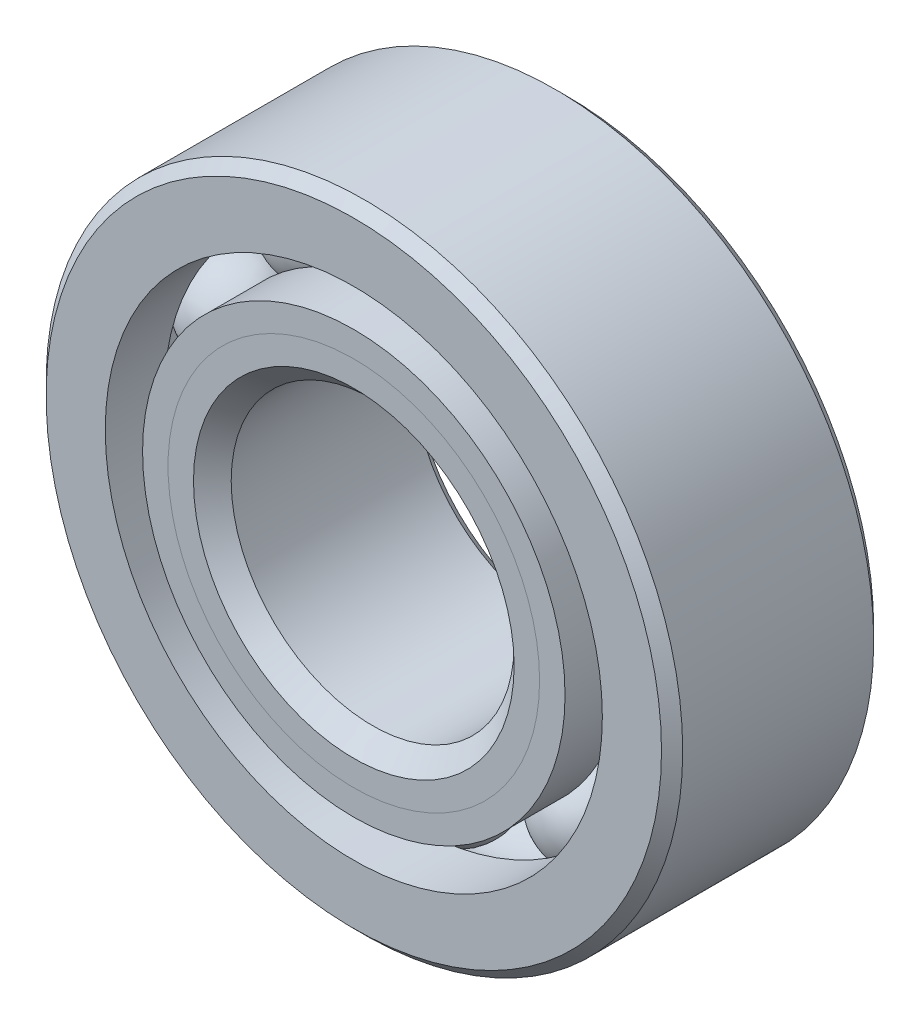
ISO-10303-21;
HEADER;
FILE_DESCRIPTION(('STEP AP214'),'2;1');
FILE_NAME('part.step','',(''),(''),'','','');
FILE_SCHEMA(('AUTOMOTIVE_DESIGN { 1 0 10303 214 1 1 1 1 }'));
ENDSEC;
DATA;
#1=APPLICATION_CONTEXT('core data for automotive mechanical design processes');
#2=APPLICATION_PROTOCOL_DEFINITION('international standard','automotive_design',2000,#1);
#3=PRODUCT_CONTEXT('',#1,'mechanical');
#4=PRODUCT('Part','Part','',(#3));
#5=PRODUCT_RELATED_PRODUCT_CATEGORY('part','',(#4));
#6=PRODUCT_DEFINITION_FORMATION('','',#4);
#7=PRODUCT_DEFINITION_CONTEXT('part definition',#1,'design');
#8=PRODUCT_DEFINITION('design','',#6,#7);
#9=PRODUCT_DEFINITION_SHAPE('','',#8);
#10=(LENGTH_UNIT() NAMED_UNIT(*) SI_UNIT(.MILLI.,.METRE.));
#11=(NAMED_UNIT(*) PLANE_ANGLE_UNIT() SI_UNIT($,.RADIAN.));
#12=(NAMED_UNIT(*) SI_UNIT($,.STERADIAN.) SOLID_ANGLE_UNIT());
#13=UNCERTAINTY_MEASURE_WITH_UNIT(LENGTH_MEASURE(1.E-05),#10,'distance_accuracy_value','');
#14=(GEOMETRIC_REPRESENTATION_CONTEXT(3) GLOBAL_UNCERTAINTY_ASSIGNED_CONTEXT((#13)) GLOBAL_UNIT_ASSIGNED_CONTEXT((#10,
#11,#12)) REPRESENTATION_CONTEXT('',''));
#15=CARTESIAN_POINT('',(0.,0.,0.));
#16=DIRECTION('',(0.,0.,1.));
#17=DIRECTION('',(1.,0.,0.));
#18=AXIS2_PLACEMENT_3D('',#15,#16,#17);
#19=CARTESIAN_POINT('',(-6.06520907209285,8.34804411070657,0.));
#20=DIRECTION('',(0.,0.,1.));
#21=DIRECTION('',(-0.587785252292462,0.809016994374955,0.));
#22=AXIS2_PLACEMENT_3D('',#19,#20,#21);
#23=SPHERICAL_SURFACE('',#22,2.27628073054021);
#24=CARTESIAN_POINT('',(-6.06520907209285,8.34804411070657,2.27628073054021));
#25=VERTEX_POINT('',#24);
#26=VERTEX_LOOP('',#25);
#27=FACE_BOUND('',#26,.T.);
#28=ADVANCED_FACE('F42',(#27),#23,.T.);
#29=CLOSED_SHELL('',(#28));
#30=MANIFOLD_SOLID_BREP('B2',#29);
#31=CARTESIAN_POINT('',(-9.81371442752058,3.1886691107066,0.));
#32=DIRECTION('',(0.,0.,1.));
#33=DIRECTION('',(-0.95105651629515,0.309016994374958,0.));
#34=AXIS2_PLACEMENT_3D('',#31,#32,#33);
#35=SPHERICAL_SURFACE('',#34,2.27628073054021);
#36=CARTESIAN_POINT('',(-9.81371442752058,3.1886691107066,2.27628073054021));
#37=VERTEX_POINT('',#36);
#38=VERTEX_LOOP('',#37);
#39=FACE_BOUND('',#38,.T.);
#40=ADVANCED_FACE('F77',(#39),#35,.T.);
#41=CLOSED_SHELL('',(#40));
#42=MANIFOLD_SOLID_BREP('B6',#41);
#43=CARTESIAN_POINT('',(-9.81371442752065,-3.18866911070639,0.));
#44=DIRECTION('',(0.,0.,1.));
#45=DIRECTION('',(-0.951056516295157,-0.309016994374938,0.));
#46=AXIS2_PLACEMENT_3D('',#43,#44,#45);
#47=SPHERICAL_SURFACE('',#46,2.27628073054021);
#48=CARTESIAN_POINT('',(-9.81371442752065,-3.18866911070639,2.27628073054021));
#49=VERTEX_POINT('',#48);
#50=VERTEX_LOOP('',#49);
#51=FACE_BOUND('',#50,.T.);
#52=ADVANCED_FACE('F112',(#51),#47,.T.);
#53=CLOSED_SHELL('',(#52));
#54=MANIFOLD_SOLID_BREP('B38',#53);
#55=CARTESIAN_POINT('',(-6.06520907209303,-8.34804411070643,0.));
#56=DIRECTION('',(0.,0.,1.));
#57=DIRECTION('',(-0.58778525229248,-0.809016994374942,0.));
#58=AXIS2_PLACEMENT_3D('',#55,#56,#57);
#59=SPHERICAL_SURFACE('',#58,2.27628073054021);
#60=CARTESIAN_POINT('',(-6.06520907209303,-8.34804411070643,2.27628073054021));
#61=VERTEX_POINT('',#60);
#62=VERTEX_LOOP('',#61);
#63=FACE_BOUND('',#62,.T.);
#64=ADVANCED_FACE('F145',(#63),#59,.T.);
#65=CLOSED_SHELL('',(#64));
#66=MANIFOLD_SOLID_BREP('B73',#65);
#67=CARTESIAN_POINT('',(0.,-10.31875,0.));
#68=DIRECTION('',(0.,0.,1.));
#69=DIRECTION('',(0.,-1.,0.));
#70=AXIS2_PLACEMENT_3D('',#67,#68,#69);
#71=SPHERICAL_SURFACE('',#70,2.27628073054021);
#72=CARTESIAN_POINT('',(0.,-10.31875,2.27628073054021));
#73=VERTEX_POINT('',#72);
#74=VERTEX_LOOP('',#73);
#75=FACE_BOUND('',#74,.T.);
#76=ADVANCED_FACE('F180',(#75),#71,.T.);
#77=CLOSED_SHELL('',(#76));
#78=MANIFOLD_SOLID_BREP('B108',#77);
#79=CARTESIAN_POINT('',(6.06520907209291,-8.34804411070652,0.));
#80=DIRECTION('',(0.,0.,1.));
#81=DIRECTION('',(0.587785252292469,-0.809016994374951,0.));
#82=AXIS2_PLACEMENT_3D('',#79,#80,#81);
#83=SPHERICAL_SURFACE('',#82,2.27628073054021);
#84=CARTESIAN_POINT('',(6.06520907209291,-8.34804411070652,2.27628073054021));
#85=VERTEX_POINT('',#84);
#86=VERTEX_LOOP('',#85);
#87=FACE_BOUND('',#86,.T.);
#88=ADVANCED_FACE('F215',(#87),#83,.T.);
#89=CLOSED_SHELL('',(#88));
#90=MANIFOLD_SOLID_BREP('B141',#89);
#91=CARTESIAN_POINT('',(9.8137144275206,-3.18866911070653,0.));
#92=DIRECTION('',(0.,0.,1.));
#93=DIRECTION('',(0.951056516295152,-0.309016994374952,0.));
#94=AXIS2_PLACEMENT_3D('',#91,#92,#93);
#95=SPHERICAL_SURFACE('',#94,2.27628073054021);
#96=CARTESIAN_POINT('',(9.8137144275206,-3.18866911070653,2.27628073054021));
#97=VERTEX_POINT('',#96);
#98=VERTEX_LOOP('',#97);
#99=FACE_BOUND('',#98,.T.);
#100=ADVANCED_FACE('F250',(#99),#95,.T.);
#101=CLOSED_SHELL('',(#100));
#102=MANIFOLD_SOLID_BREP('B176',#101);
#103=CARTESIAN_POINT('',(9.81371442752063,3.18866911070646,0.));
#104=DIRECTION('',(0.,0.,1.));
#105=DIRECTION('',(0.951056516295155,0.309016994374945,0.));
#106=AXIS2_PLACEMENT_3D('',#103,#104,#105);
#107=SPHERICAL_SURFACE('',#106,2.27628073054021);
#108=CARTESIAN_POINT('',(9.81371442752063,3.18866911070646,2.27628073054021));
#109=VERTEX_POINT('',#108);
#110=VERTEX_LOOP('',#109);
#111=FACE_BOUND('',#110,.T.);
#112=ADVANCED_FACE('F285',(#111),#107,.T.);
#113=CLOSED_SHELL('',(#112));
#114=MANIFOLD_SOLID_BREP('B211',#113);
#115=CARTESIAN_POINT('',(6.06520907209297,8.34804411070648,0.));
#116=DIRECTION('',(0.,0.,1.));
#117=DIRECTION('',(0.587785252292474,0.809016994374947,0.));
#118=AXIS2_PLACEMENT_3D('',#115,#116,#117);
#119=SPHERICAL_SURFACE('',#118,2.27628073054021);
#120=CARTESIAN_POINT('',(6.06520907209297,8.34804411070648,2.27628073054021));
#121=VERTEX_POINT('',#120);
#122=VERTEX_LOOP('',#121);
#123=FACE_BOUND('',#122,.T.);
#124=ADVANCED_FACE('F320',(#123),#119,.T.);
#125=CLOSED_SHELL('',(#124));
#126=MANIFOLD_SOLID_BREP('B246',#125);
#127=CARTESIAN_POINT('',(0.,10.31875,0.));
#128=DIRECTION('',(0.,0.,1.));
#129=DIRECTION('',(0.,1.,0.));
#130=AXIS2_PLACEMENT_3D('',#127,#128,#129);
#131=SPHERICAL_SURFACE('',#130,2.27628073054021);
#132=CARTESIAN_POINT('',(0.,10.31875,2.27628073054021));
#133=VERTEX_POINT('',#132);
#134=VERTEX_LOOP('',#133);
#135=FACE_BOUND('',#134,.T.);
#136=ADVANCED_FACE('F357',(#135),#131,.T.);
#137=CLOSED_SHELL('',(#136));
#138=MANIFOLD_SOLID_BREP('B281',#137);
#139=CARTESIAN_POINT('',(0.,8.33881099868363,4.7625));
#140=DIRECTION('',(0.,0.,-1.));
#141=DIRECTION('',(-1.,0.,0.));
#142=AXIS2_PLACEMENT_3D('',#139,#140,#141);
#143=PLANE('',#142);
#144=CARTESIAN_POINT('',(0.,0.,4.7625));
#145=DIRECTION('',(0.,0.,1.));
#146=DIRECTION('',(1.,0.,0.));
#147=AXIS2_PLACEMENT_3D('',#144,#145,#146);
#148=CIRCLE('',#147,7.19623463472989);
#149=CARTESIAN_POINT('',(7.19623463472989,0.,4.7625));
#150=VERTEX_POINT('',#149);
#151=EDGE_CURVE('E414',#150,#150,#148,.T.);
#152=ORIENTED_EDGE('',*,*,#151,.F.);
#153=EDGE_LOOP('',(#152));
#154=FACE_BOUND('',#153,.T.);
#155=CARTESIAN_POINT('',(0.,0.,4.7625));
#156=DIRECTION('',(0.,0.,1.));
#157=DIRECTION('',(1.,0.,0.));
#158=AXIS2_PLACEMENT_3D('',#155,#156,#157);
#159=CIRCLE('',#158,8.33881099868363);
#160=CARTESIAN_POINT('',(8.33881099868363,0.,4.7625));
#161=VERTEX_POINT('',#160);
#162=EDGE_CURVE('E356',#161,#161,#159,.T.);
#163=ORIENTED_EDGE('',*,*,#162,.T.);
#164=EDGE_LOOP('',(#163));
#165=FACE_BOUND('',#164,.T.);
#166=ADVANCED_FACE('F380',(#154,#165),#143,.F.);
#167=CARTESIAN_POINT('',(0.,0.,3.61992363604627));
#168=DIRECTION('',(0.,0.,1.));
#169=DIRECTION('',(1.,0.,0.));
#170=AXIS2_PLACEMENT_3D('',#167,#168,#169);
#171=CONICAL_SURFACE('',#170,7.19623463472989,0.78539816339745);
#172=ORIENTED_EDGE('',*,*,#162,.F.);
#173=EDGE_LOOP('',(#172));
#174=FACE_BOUND('',#173,.T.);
#175=CARTESIAN_POINT('',(0.,0.,3.61992363604627));
#176=DIRECTION('',(0.,0.,1.));
#177=DIRECTION('',(1.,0.,0.));
#178=AXIS2_PLACEMENT_3D('',#175,#176,#177);
#179=CIRCLE('',#178,7.19623463472989);
#180=CARTESIAN_POINT('',(7.19623463472989,0.,3.61992363604627));
#181=VERTEX_POINT('',#180);
#182=EDGE_CURVE('E386',#181,#181,#179,.T.);
#183=ORIENTED_EDGE('',*,*,#182,.T.);
#184=EDGE_LOOP('',(#183));
#185=FACE_BOUND('',#184,.T.);
#186=ADVANCED_FACE('F421',(#174,#185),#171,.T.);
#187=CARTESIAN_POINT('',(0.,0.,4.7625));
#188=DIRECTION('',(0.,0.,1.));
#189=DIRECTION('',(1.,0.,0.));
#190=AXIS2_PLACEMENT_3D('',#187,#188,#189);
#191=CYLINDRICAL_SURFACE('',#190,7.19623463472989);
#192=ORIENTED_EDGE('',*,*,#182,.F.);
#193=EDGE_LOOP('',(#192));
#194=FACE_BOUND('',#193,.T.);
#195=CARTESIAN_POINT('',(0.,0.,0.));
#196=DIRECTION('',(0.,0.,1.));
#197=DIRECTION('',(1.,0.,0.));
#198=AXIS2_PLACEMENT_3D('',#195,#196,#197);
#199=CIRCLE('',#198,7.19623463472989);
#200=CARTESIAN_POINT('',(7.19623463472989,0.,0.));
#201=VERTEX_POINT('',#200);
#202=EDGE_CURVE('E390',#201,#201,#199,.T.);
#203=ORIENTED_EDGE('',*,*,#202,.T.);
#204=EDGE_LOOP('',(#203));
#205=FACE_BOUND('',#204,.T.);
#206=ADVANCED_FACE('F425',(#194,#205),#191,.T.);
#207=CARTESIAN_POINT('',(0.,7.19623463472989,0.));
#208=DIRECTION('',(0.,0.,-1.));
#209=DIRECTION('',(-1.,0.,0.));
#210=AXIS2_PLACEMENT_3D('',#207,#208,#209);
#211=PLANE('',#210);
#212=ORIENTED_EDGE('',*,*,#202,.F.);
#213=EDGE_LOOP('',(#212));
#214=FACE_BOUND('',#213,.T.);
#215=CARTESIAN_POINT('',(0.,0.,0.));
#216=DIRECTION('',(0.,0.,1.));
#217=DIRECTION('',(1.,0.,0.));
#218=AXIS2_PLACEMENT_3D('',#215,#216,#217);
#219=CIRCLE('',#218,8.04246926945979);
#220=CARTESIAN_POINT('',(8.04246926945979,0.,0.));
#221=VERTEX_POINT('',#220);
#222=EDGE_CURVE('E394',#221,#221,#219,.T.);
#223=ORIENTED_EDGE('',*,*,#222,.T.);
#224=EDGE_LOOP('',(#223));
#225=FACE_BOUND('',#224,.T.);
#226=ADVANCED_FACE('F430',(#214,#225),#211,.F.);
#227=CARTESIAN_POINT('',(0.,0.,0.));
#228=DIRECTION('',(0.,0.,1.));
#229=DIRECTION('',(1.,0.,0.));
#230=AXIS2_PLACEMENT_3D('',#227,#228,#229);
#231=TOROIDAL_SURFACE('',#230,10.31875,2.27628073054021);
#232=ORIENTED_EDGE('',*,*,#222,.F.);
#233=EDGE_LOOP('',(#232));
#234=FACE_BOUND('',#233,.T.);
#235=CARTESIAN_POINT('',(0.,0.,-2.11666666666667));
#236=DIRECTION('',(0.,0.,1.));
#237=DIRECTION('',(1.,0.,0.));
#238=AXIS2_PLACEMENT_3D('',#235,#236,#237);
#239=CIRCLE('',#238,9.48138736263737);
#240=CARTESIAN_POINT('',(9.48138736263737,0.,-2.11666666666667));
#241=VERTEX_POINT('',#240);
#242=EDGE_CURVE('E399',#241,#241,#239,.T.);
#243=ORIENTED_EDGE('',*,*,#242,.T.);
#244=EDGE_LOOP('',(#243));
#245=FACE_BOUND('',#244,.T.);
#246=ADVANCED_FACE('F436',(#234,#245),#231,.F.);
#247=CARTESIAN_POINT('',(0.,0.,4.7625));
#248=DIRECTION('',(0.,0.,1.));
#249=DIRECTION('',(1.,0.,0.));
#250=AXIS2_PLACEMENT_3D('',#247,#248,#249);
#251=CYLINDRICAL_SURFACE('',#250,9.48138736263737);
#252=ORIENTED_EDGE('',*,*,#242,.F.);
#253=EDGE_LOOP('',(#252));
#254=FACE_BOUND('',#253,.T.);
#255=CARTESIAN_POINT('',(0.,0.,-4.76250000000001));
#256=DIRECTION('',(0.,0.,1.));
#257=DIRECTION('',(1.,0.,0.));
#258=AXIS2_PLACEMENT_3D('',#255,#256,#257);
#259=CIRCLE('',#258,9.48138736263736);
#260=CARTESIAN_POINT('',(9.48138736263736,0.,-4.76250000000001));
#261=VERTEX_POINT('',#260);
#262=EDGE_CURVE('E402',#261,#261,#259,.T.);
#263=ORIENTED_EDGE('',*,*,#262,.T.);
#264=EDGE_LOOP('',(#263));
#265=FACE_BOUND('',#264,.T.);
#266=ADVANCED_FACE('F440',(#254,#265),#251,.T.);
#267=CARTESIAN_POINT('',(0.,6.82625,-4.7625));
#268=DIRECTION('',(0.,0.,1.));
#269=DIRECTION('',(1.,0.,0.));
#270=AXIS2_PLACEMENT_3D('',#267,#268,#269);
#271=PLANE('',#270);
#272=ORIENTED_EDGE('',*,*,#262,.F.);
#273=EDGE_LOOP('',(#272));
#274=FACE_BOUND('',#273,.T.);
#275=CARTESIAN_POINT('',(0.,0.,-4.7625));
#276=DIRECTION('',(0.,0.,1.));
#277=DIRECTION('',(1.,0.,0.));
#278=AXIS2_PLACEMENT_3D('',#275,#276,#277);
#279=CIRCLE('',#278,6.82625);
#280=CARTESIAN_POINT('',(6.82625,0.,-4.7625));
#281=VERTEX_POINT('',#280);
#282=EDGE_CURVE('E405',#281,#281,#279,.T.);
#283=ORIENTED_EDGE('',*,*,#282,.T.);
#284=EDGE_LOOP('',(#283));
#285=FACE_BOUND('',#284,.T.);
#286=ADVANCED_FACE('F444',(#274,#285),#271,.F.);
#287=CARTESIAN_POINT('',(0.,0.,-4.28625));
#288=DIRECTION('',(0.,0.,-1.));
#289=DIRECTION('',(-1.,0.,0.));
#290=AXIS2_PLACEMENT_3D('',#287,#288,#289);
#291=CONICAL_SURFACE('',#290,6.35,0.785398163397448);
#292=ORIENTED_EDGE('',*,*,#282,.F.);
#293=EDGE_LOOP('',(#292));
#294=FACE_BOUND('',#293,.T.);
#295=CARTESIAN_POINT('',(0.,0.,-4.28625));
#296=DIRECTION('',(0.,0.,1.));
#297=DIRECTION('',(1.,0.,0.));
#298=AXIS2_PLACEMENT_3D('',#295,#296,#297);
#299=CIRCLE('',#298,6.35);
#300=CARTESIAN_POINT('',(6.35,0.,-4.28625));
#301=VERTEX_POINT('',#300);
#302=EDGE_CURVE('E408',#301,#301,#299,.T.);
#303=ORIENTED_EDGE('',*,*,#302,.T.);
#304=EDGE_LOOP('',(#303));
#305=FACE_BOUND('',#304,.T.);
#306=ADVANCED_FACE('F448',(#294,#305),#291,.F.);
#307=CARTESIAN_POINT('',(0.,0.,4.7625));
#308=DIRECTION('',(0.,0.,1.));
#309=DIRECTION('',(1.,0.,0.));
#310=AXIS2_PLACEMENT_3D('',#307,#308,#309);
#311=CYLINDRICAL_SURFACE('',#310,6.35);
#312=ORIENTED_EDGE('',*,*,#302,.F.);
#313=EDGE_LOOP('',(#312));
#314=FACE_BOUND('',#313,.T.);
#315=CARTESIAN_POINT('',(0.,0.,3.91626536527011));
#316=DIRECTION('',(0.,0.,1.));
#317=DIRECTION('',(1.,0.,0.));
#318=AXIS2_PLACEMENT_3D('',#315,#316,#317);
#319=CIRCLE('',#318,6.35);
#320=CARTESIAN_POINT('',(6.35,0.,3.91626536527011));
#321=VERTEX_POINT('',#320);
#322=EDGE_CURVE('E411',#321,#321,#319,.T.);
#323=ORIENTED_EDGE('',*,*,#322,.T.);
#324=EDGE_LOOP('',(#323));
#325=FACE_BOUND('',#324,.T.);
#326=ADVANCED_FACE('F452',(#314,#325),#311,.F.);
#327=CARTESIAN_POINT('',(0.,0.,4.7625));
#328=DIRECTION('',(0.,0.,1.));
#329=DIRECTION('',(1.,0.,0.));
#330=AXIS2_PLACEMENT_3D('',#327,#328,#329);
#331=CONICAL_SURFACE('',#330,7.19623463472989,0.78539816339745);
#332=ORIENTED_EDGE('',*,*,#322,.F.);
#333=EDGE_LOOP('',(#332));
#334=FACE_BOUND('',#333,.T.);
#335=ORIENTED_EDGE('',*,*,#151,.T.);
#336=EDGE_LOOP('',(#335));
#337=FACE_BOUND('',#336,.T.);
#338=ADVANCED_FACE('F418',(#334,#337),#331,.F.);
#339=CLOSED_SHELL('',(#166,#186,#206,#226,#246,#266,#286,#306,#326,#338));
#340=MANIFOLD_SOLID_BREP('B316',#339);
#341=CARTESIAN_POINT('',(0.,9.48138736263737,4.7625));
#342=DIRECTION('',(0.,0.,-1.));
#343=DIRECTION('',(-1.,0.,0.));
#344=AXIS2_PLACEMENT_3D('',#341,#342,#343);
#345=PLANE('',#344);
#346=CARTESIAN_POINT('',(0.,0.,4.7625));
#347=DIRECTION('',(0.,0.,1.));
#348=DIRECTION('',(1.,0.,0.));
#349=AXIS2_PLACEMENT_3D('',#346,#347,#348);
#350=CIRCLE('',#349,8.33881099868363);
#351=CARTESIAN_POINT('',(8.33881099868363,0.,4.7625));
#352=VERTEX_POINT('',#351);
#353=EDGE_CURVE('E379',#352,#352,#350,.T.);
#354=ORIENTED_EDGE('',*,*,#353,.F.);
#355=EDGE_LOOP('',(#354));
#356=FACE_BOUND('',#355,.T.);
#357=CARTESIAN_POINT('',(0.,0.,4.7625));
#358=DIRECTION('',(0.,0.,1.));
#359=DIRECTION('',(1.,0.,0.));
#360=AXIS2_PLACEMENT_3D('',#357,#358,#359);
#361=CIRCLE('',#360,9.48138736263737);
#362=CARTESIAN_POINT('',(9.48138736263737,0.,4.7625));
#363=VERTEX_POINT('',#362);
#364=EDGE_CURVE('E563',#363,#363,#361,.T.);
#365=ORIENTED_EDGE('',*,*,#364,.T.);
#366=EDGE_LOOP('',(#365));
#367=FACE_BOUND('',#366,.T.);
#368=ADVANCED_FACE('F541',(#356,#367),#345,.F.);
#369=CARTESIAN_POINT('',(0.,0.,4.7625));
#370=DIRECTION('',(0.,0.,1.));
#371=DIRECTION('',(1.,0.,0.));
#372=AXIS2_PLACEMENT_3D('',#369,#370,#371);
#373=CONICAL_SURFACE('',#372,8.33881099868363,0.78539816339745);
#374=CARTESIAN_POINT('',(0.,0.,3.61992363604627));
#375=DIRECTION('',(0.,0.,1.));
#376=DIRECTION('',(1.,0.,0.));
#377=AXIS2_PLACEMENT_3D('',#374,#375,#376);
#378=CIRCLE('',#377,7.19623463472989);
#379=CARTESIAN_POINT('',(7.19623463472989,0.,3.61992363604627));
#380=VERTEX_POINT('',#379);
#381=EDGE_CURVE('E547',#380,#380,#378,.T.);
#382=ORIENTED_EDGE('',*,*,#381,.F.);
#383=EDGE_LOOP('',(#382));
#384=FACE_BOUND('',#383,.T.);
#385=ORIENTED_EDGE('',*,*,#353,.T.);
#386=EDGE_LOOP('',(#385));
#387=FACE_BOUND('',#386,.T.);
#388=ADVANCED_FACE('F588',(#384,#387),#373,.F.);
#389=CARTESIAN_POINT('',(0.,0.,4.7625));
#390=DIRECTION('',(0.,0.,1.));
#391=DIRECTION('',(1.,0.,0.));
#392=AXIS2_PLACEMENT_3D('',#389,#390,#391);
#393=CYLINDRICAL_SURFACE('',#392,7.19623463472989);
#394=CARTESIAN_POINT('',(0.,0.,0.));
#395=DIRECTION('',(0.,0.,1.));
#396=DIRECTION('',(1.,0.,0.));
#397=AXIS2_PLACEMENT_3D('',#394,#395,#396);
#398=CIRCLE('',#397,7.19623463472989);
#399=CARTESIAN_POINT('',(7.19623463472989,0.,0.));
#400=VERTEX_POINT('',#399);
#401=EDGE_CURVE('E551',#400,#400,#398,.T.);
#402=ORIENTED_EDGE('',*,*,#401,.F.);
#403=EDGE_LOOP('',(#402));
#404=FACE_BOUND('',#403,.T.);
#405=ORIENTED_EDGE('',*,*,#381,.T.);
#406=EDGE_LOOP('',(#405));
#407=FACE_BOUND('',#406,.T.);
#408=ADVANCED_FACE('F583',(#404,#407),#393,.F.);
#409=CARTESIAN_POINT('',(0.,7.19623463472989,0.));
#410=DIRECTION('',(0.,0.,1.));
#411=DIRECTION('',(1.,0.,0.));
#412=AXIS2_PLACEMENT_3D('',#409,#410,#411);
#413=PLANE('',#412);
#414=CARTESIAN_POINT('',(0.,0.,0.));
#415=DIRECTION('',(0.,0.,1.));
#416=DIRECTION('',(1.,0.,0.));
#417=AXIS2_PLACEMENT_3D('',#414,#415,#416);
#418=CIRCLE('',#417,8.04246926945979);
#419=CARTESIAN_POINT('',(8.04246926945979,0.,0.));
#420=VERTEX_POINT('',#419);
#421=EDGE_CURVE('E555',#420,#420,#418,.T.);
#422=ORIENTED_EDGE('',*,*,#421,.F.);
#423=EDGE_LOOP('',(#422));
#424=FACE_BOUND('',#423,.T.);
#425=ORIENTED_EDGE('',*,*,#401,.T.);
#426=EDGE_LOOP('',(#425));
#427=FACE_BOUND('',#426,.T.);
#428=ADVANCED_FACE('F577',(#424,#427),#413,.F.);
#429=CARTESIAN_POINT('',(0.,0.,0.));
#430=DIRECTION('',(0.,0.,1.));
#431=DIRECTION('',(1.,0.,0.));
#432=AXIS2_PLACEMENT_3D('',#429,#430,#431);
#433=TOROIDAL_SURFACE('',#432,10.31875,2.27628073054021);
#434=CARTESIAN_POINT('',(0.,0.,2.11666666666667));
#435=DIRECTION('',(0.,0.,1.));
#436=DIRECTION('',(1.,0.,0.));
#437=AXIS2_PLACEMENT_3D('',#434,#435,#436);
#438=CIRCLE('',#437,9.48138736263737);
#439=CARTESIAN_POINT('',(9.48138736263737,0.,2.11666666666667));
#440=VERTEX_POINT('',#439);
#441=EDGE_CURVE('E560',#440,#440,#438,.T.);
#442=ORIENTED_EDGE('',*,*,#441,.F.);
#443=EDGE_LOOP('',(#442));
#444=FACE_BOUND('',#443,.T.);
#445=ORIENTED_EDGE('',*,*,#421,.T.);
#446=EDGE_LOOP('',(#445));
#447=FACE_BOUND('',#446,.T.);
#448=ADVANCED_FACE('F571',(#444,#447),#433,.F.);
#449=CARTESIAN_POINT('',(0.,0.,4.7625));
#450=DIRECTION('',(0.,0.,1.));
#451=DIRECTION('',(1.,0.,0.));
#452=AXIS2_PLACEMENT_3D('',#449,#450,#451);
#453=CYLINDRICAL_SURFACE('',#452,9.48138736263737);
#454=ORIENTED_EDGE('',*,*,#364,.F.);
#455=EDGE_LOOP('',(#454));
#456=FACE_BOUND('',#455,.T.);
#457=ORIENTED_EDGE('',*,*,#441,.T.);
#458=EDGE_LOOP('',(#457));
#459=FACE_BOUND('',#458,.T.);
#460=ADVANCED_FACE('F568',(#456,#459),#453,.T.);
#461=CLOSED_SHELL('',(#368,#388,#408,#428,#448,#460));
#462=MANIFOLD_SOLID_BREP('B351',#461);
#463=CARTESIAN_POINT('',(0.,0.,4.28625));
#464=DIRECTION('',(0.,0.,-1.));
#465=DIRECTION('',(-1.,0.,0.));
#466=AXIS2_PLACEMENT_3D('',#463,#464,#465);
#467=CONICAL_SURFACE('',#466,14.2875,0.785398163397442);
#468=CARTESIAN_POINT('',(0.,0.,4.7625));
#469=DIRECTION('',(0.,0.,1.));
#470=DIRECTION('',(1.,0.,0.));
#471=AXIS2_PLACEMENT_3D('',#468,#469,#470);
#472=CIRCLE('',#471,13.81125);
#473=CARTESIAN_POINT('',(13.81125,0.,4.7625));
#474=VERTEX_POINT('',#473);
#475=EDGE_CURVE('E663',#474,#474,#472,.T.);
#476=ORIENTED_EDGE('',*,*,#475,.F.);
#477=EDGE_LOOP('',(#476));
#478=FACE_BOUND('',#477,.T.);
#479=CARTESIAN_POINT('',(0.,0.,4.28625));
#480=DIRECTION('',(0.,0.,1.));
#481=DIRECTION('',(1.,0.,0.));
#482=AXIS2_PLACEMENT_3D('',#479,#480,#481);
#483=CIRCLE('',#482,14.2875);
#484=CARTESIAN_POINT('',(14.2875,0.,4.28625));
#485=VERTEX_POINT('',#484);
#486=EDGE_CURVE('E540',#485,#485,#483,.T.);
#487=ORIENTED_EDGE('',*,*,#486,.T.);
#488=EDGE_LOOP('',(#487));
#489=FACE_BOUND('',#488,.T.);
#490=ADVANCED_FACE('F635',(#478,#489),#467,.T.);
#491=CARTESIAN_POINT('',(0.,0.,4.7625));
#492=DIRECTION('',(0.,0.,1.));
#493=DIRECTION('',(1.,0.,0.));
#494=AXIS2_PLACEMENT_3D('',#491,#492,#493);
#495=CYLINDRICAL_SURFACE('',#494,14.2875);
#496=ORIENTED_EDGE('',*,*,#486,.F.);
#497=EDGE_LOOP('',(#496));
#498=FACE_BOUND('',#497,.T.);
#499=CARTESIAN_POINT('',(0.,0.,-4.28625));
#500=DIRECTION('',(0.,0.,1.));
#501=DIRECTION('',(1.,0.,0.));
#502=AXIS2_PLACEMENT_3D('',#499,#500,#501);
#503=CIRCLE('',#502,14.2875);
#504=CARTESIAN_POINT('',(14.2875,0.,-4.28625));
#505=VERTEX_POINT('',#504);
#506=EDGE_CURVE('E641',#505,#505,#503,.T.);
#507=ORIENTED_EDGE('',*,*,#506,.T.);
#508=EDGE_LOOP('',(#507));
#509=FACE_BOUND('',#508,.T.);
#510=ADVANCED_FACE('F670',(#498,#509),#495,.T.);
#511=CARTESIAN_POINT('',(0.,0.,-4.7625));
#512=DIRECTION('',(0.,0.,1.));
#513=DIRECTION('',(1.,0.,0.));
#514=AXIS2_PLACEMENT_3D('',#511,#512,#513);
#515=CONICAL_SURFACE('',#514,13.81125,0.785398163397443);
#516=ORIENTED_EDGE('',*,*,#506,.F.);
#517=EDGE_LOOP('',(#516));
#518=FACE_BOUND('',#517,.T.);
#519=CARTESIAN_POINT('',(0.,0.,-4.7625));
#520=DIRECTION('',(0.,0.,1.));
#521=DIRECTION('',(1.,0.,0.));
#522=AXIS2_PLACEMENT_3D('',#519,#520,#521);
#523=CIRCLE('',#522,13.81125);
#524=CARTESIAN_POINT('',(13.81125,0.,-4.7625));
#525=VERTEX_POINT('',#524);
#526=EDGE_CURVE('E645',#525,#525,#523,.T.);
#527=ORIENTED_EDGE('',*,*,#526,.T.);
#528=EDGE_LOOP('',(#527));
#529=FACE_BOUND('',#528,.T.);
#530=ADVANCED_FACE('F674',(#518,#529),#515,.T.);
#531=CARTESIAN_POINT('',(0.,13.81125,-4.7625));
#532=DIRECTION('',(0.,0.,1.));
#533=DIRECTION('',(1.,0.,0.));
#534=AXIS2_PLACEMENT_3D('',#531,#532,#533);
#535=PLANE('',#534);
#536=ORIENTED_EDGE('',*,*,#526,.F.);
#537=EDGE_LOOP('',(#536));
#538=FACE_BOUND('',#537,.T.);
#539=CARTESIAN_POINT('',(0.,0.,-4.76250000000001));
#540=DIRECTION('',(0.,0.,1.));
#541=DIRECTION('',(1.,0.,0.));
#542=AXIS2_PLACEMENT_3D('',#539,#540,#541);
#543=CIRCLE('',#542,11.1561126373626);
#544=CARTESIAN_POINT('',(11.1561126373626,0.,-4.76250000000001));
#545=VERTEX_POINT('',#544);
#546=EDGE_CURVE('E649',#545,#545,#543,.T.);
#547=ORIENTED_EDGE('',*,*,#546,.T.);
#548=EDGE_LOOP('',(#547));
#549=FACE_BOUND('',#548,.T.);
#550=ADVANCED_FACE('F679',(#538,#549),#535,.F.);
#551=CARTESIAN_POINT('',(0.,0.,4.7625));
#552=DIRECTION('',(0.,0.,1.));
#553=DIRECTION('',(1.,0.,0.));
#554=AXIS2_PLACEMENT_3D('',#551,#552,#553);
#555=CYLINDRICAL_SURFACE('',#554,11.1561126373626);
#556=ORIENTED_EDGE('',*,*,#546,.F.);
#557=EDGE_LOOP('',(#556));
#558=FACE_BOUND('',#557,.T.);
#559=CARTESIAN_POINT('',(0.,0.,-2.11666666666667));
#560=DIRECTION('',(0.,0.,1.));
#561=DIRECTION('',(1.,0.,0.));
#562=AXIS2_PLACEMENT_3D('',#559,#560,#561);
#563=CIRCLE('',#562,11.1561126373626);
#564=CARTESIAN_POINT('',(11.1561126373626,0.,-2.11666666666667));
#565=VERTEX_POINT('',#564);
#566=EDGE_CURVE('E654',#565,#565,#563,.T.);
#567=ORIENTED_EDGE('',*,*,#566,.T.);
#568=EDGE_LOOP('',(#567));
#569=FACE_BOUND('',#568,.T.);
#570=ADVANCED_FACE('F685',(#558,#569),#555,.F.);
#571=CARTESIAN_POINT('',(0.,0.,0.));
#572=DIRECTION('',(0.,0.,1.));
#573=DIRECTION('',(1.,0.,0.));
#574=AXIS2_PLACEMENT_3D('',#571,#572,#573);
#575=TOROIDAL_SURFACE('',#574,10.31875,2.27628073054021);
#576=ORIENTED_EDGE('',*,*,#566,.F.);
#577=EDGE_LOOP('',(#576));
#578=FACE_BOUND('',#577,.T.);
#579=CARTESIAN_POINT('',(0.,0.,2.11666666666667));
#580=DIRECTION('',(0.,0.,1.));
#581=DIRECTION('',(1.,0.,0.));
#582=AXIS2_PLACEMENT_3D('',#579,#580,#581);
#583=CIRCLE('',#582,11.1561126373626);
#584=CARTESIAN_POINT('',(11.1561126373626,0.,2.11666666666667));
#585=VERTEX_POINT('',#584);
#586=EDGE_CURVE('E657',#585,#585,#583,.T.);
#587=ORIENTED_EDGE('',*,*,#586,.T.);
#588=EDGE_LOOP('',(#587));
#589=FACE_BOUND('',#588,.T.);
#590=ADVANCED_FACE('F689',(#578,#589),#575,.F.);
#591=CARTESIAN_POINT('',(0.,0.,4.7625));
#592=DIRECTION('',(0.,0.,1.));
#593=DIRECTION('',(1.,0.,0.));
#594=AXIS2_PLACEMENT_3D('',#591,#592,#593);
#595=CYLINDRICAL_SURFACE('',#594,11.1561126373626);
#596=ORIENTED_EDGE('',*,*,#586,.F.);
#597=EDGE_LOOP('',(#596));
#598=FACE_BOUND('',#597,.T.);
#599=CARTESIAN_POINT('',(0.,0.,4.7625));
#600=DIRECTION('',(0.,0.,1.));
#601=DIRECTION('',(1.,0.,0.));
#602=AXIS2_PLACEMENT_3D('',#599,#600,#601);
#603=CIRCLE('',#602,11.1561126373626);
#604=CARTESIAN_POINT('',(11.1561126373626,0.,4.7625));
#605=VERTEX_POINT('',#604);
#606=EDGE_CURVE('E660',#605,#605,#603,.T.);
#607=ORIENTED_EDGE('',*,*,#606,.T.);
#608=EDGE_LOOP('',(#607));
#609=FACE_BOUND('',#608,.T.);
#610=ADVANCED_FACE('F693',(#598,#609),#595,.F.);
#611=CARTESIAN_POINT('',(0.,13.81125,4.7625));
#612=DIRECTION('',(0.,0.,-1.));
#613=DIRECTION('',(-1.,0.,0.));
#614=AXIS2_PLACEMENT_3D('',#611,#612,#613);
#615=PLANE('',#614);
#616=ORIENTED_EDGE('',*,*,#606,.F.);
#617=EDGE_LOOP('',(#616));
#618=FACE_BOUND('',#617,.T.);
#619=ORIENTED_EDGE('',*,*,#475,.T.);
#620=EDGE_LOOP('',(#619));
#621=FACE_BOUND('',#620,.T.);
#622=ADVANCED_FACE('F667',(#618,#621),#615,.F.);
#623=CLOSED_SHELL('',(#490,#510,#530,#550,#570,#590,#610,#622));
#624=MANIFOLD_SOLID_BREP('B374',#623);
#625=ADVANCED_BREP_SHAPE_REPRESENTATION('',(#18,#30,#42,#54,#66,#78,#90,#102,#114,#126,#138,
#340,#462,#624),#14);
#626=SHAPE_DEFINITION_REPRESENTATION(#9,#625);
ENDSEC;
END-ISO-10303-21;
